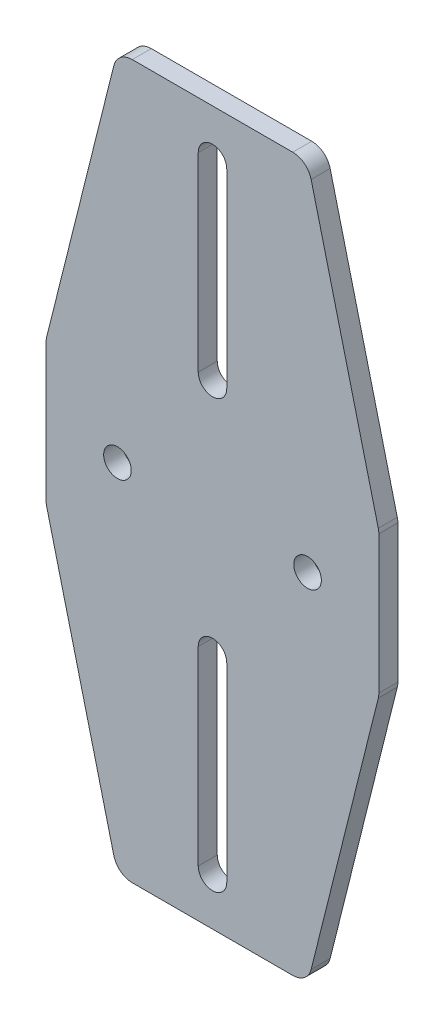
ISO-10303-21;
HEADER;
FILE_DESCRIPTION(('STEP AP214'),'2;1');
FILE_NAME('part.step','',(''),(''),'','','');
FILE_SCHEMA(('AUTOMOTIVE_DESIGN { 1 0 10303 214 1 1 1 1 }'));
ENDSEC;
DATA;
#1=APPLICATION_CONTEXT('core data for automotive mechanical design processes');
#2=APPLICATION_PROTOCOL_DEFINITION('international standard','automotive_design',2000,#1);
#3=PRODUCT_CONTEXT('',#1,'mechanical');
#4=PRODUCT('Part','Part','',(#3));
#5=PRODUCT_RELATED_PRODUCT_CATEGORY('part','',(#4));
#6=PRODUCT_DEFINITION_FORMATION('','',#4);
#7=PRODUCT_DEFINITION_CONTEXT('part definition',#1,'design');
#8=PRODUCT_DEFINITION('design','',#6,#7);
#9=PRODUCT_DEFINITION_SHAPE('','',#8);
#10=(LENGTH_UNIT() NAMED_UNIT(*) SI_UNIT(.MILLI.,.METRE.));
#11=(NAMED_UNIT(*) PLANE_ANGLE_UNIT() SI_UNIT($,.RADIAN.));
#12=(NAMED_UNIT(*) SI_UNIT($,.STERADIAN.) SOLID_ANGLE_UNIT());
#13=UNCERTAINTY_MEASURE_WITH_UNIT(LENGTH_MEASURE(1.E-05),#10,'distance_accuracy_value','');
#14=(GEOMETRIC_REPRESENTATION_CONTEXT(3) GLOBAL_UNCERTAINTY_ASSIGNED_CONTEXT((#13)) GLOBAL_UNIT_ASSIGNED_CONTEXT((#10,
#11,#12)) REPRESENTATION_CONTEXT('',''));
#15=CARTESIAN_POINT('',(0.,0.,0.));
#16=DIRECTION('',(0.,0.,1.));
#17=DIRECTION('',(1.,0.,0.));
#18=AXIS2_PLACEMENT_3D('',#15,#16,#17);
#19=CARTESIAN_POINT('',(0.,0.,2.));
#20=DIRECTION('',(1.,0.,0.));
#21=DIRECTION('',(0.,0.,-1.));
#22=AXIS2_PLACEMENT_3D('',#19,#20,#21);
#23=PLANE('',#22);
#24=DIRECTION('',(0.,-1.,0.));
#25=VECTOR('',#24,1.);
#26=CARTESIAN_POINT('',(0.,0.,0.));
#27=LINE('',#26,#25);
#28=CARTESIAN_POINT('',(0.,-0.246211251235321,0.));
#29=VERTEX_POINT('',#28);
#30=CARTESIAN_POINT('',(0.,-14.7537887487647,0.));
#31=VERTEX_POINT('',#30);
#32=EDGE_CURVE('E305',#29,#31,#27,.T.);
#33=ORIENTED_EDGE('',*,*,#32,.T.);
#34=DIRECTION('',(0.,0.,-1.));
#35=VECTOR('',#34,1.);
#36=CARTESIAN_POINT('',(0.,-14.7537887487647,2.));
#37=LINE('',#36,#35);
#38=CARTESIAN_POINT('',(0.,-14.7537887487647,2.));
#39=VERTEX_POINT('',#38);
#40=EDGE_CURVE('E380',#31,#39,#37,.F.);
#41=ORIENTED_EDGE('',*,*,#40,.T.);
#42=DIRECTION('',(0.,-1.,0.));
#43=VECTOR('',#42,1.);
#44=CARTESIAN_POINT('',(0.,0.,2.));
#45=LINE('',#44,#43);
#46=CARTESIAN_POINT('',(0.,-0.246211251235321,2.));
#47=VERTEX_POINT('',#46);
#48=EDGE_CURVE('E281',#47,#39,#45,.T.);
#49=ORIENTED_EDGE('',*,*,#48,.F.);
#50=DIRECTION('',(0.,0.,-1.));
#51=VECTOR('',#50,1.);
#52=CARTESIAN_POINT('',(0.,-0.246211251235321,2.));
#53=LINE('',#52,#51);
#54=EDGE_CURVE('E377',#47,#29,#53,.T.);
#55=ORIENTED_EDGE('',*,*,#54,.T.);
#56=EDGE_LOOP('',(#33,#41,#49,#55));
#57=FACE_BOUND('',#56,.T.);
#58=ADVANCED_FACE('F39',(#57),#23,.F.);
#59=CARTESIAN_POINT('',(0.,-15.,2.));
#60=DIRECTION('',(0.970142500145332,0.242535625036333,0.));
#61=DIRECTION('',(-0.242535625036333,0.970142500145332,0.));
#62=AXIS2_PLACEMENT_3D('',#59,#60,#61);
#63=PLANE('',#62);
#64=DIRECTION('',(0.242535625036333,-0.970142500145332,0.));
#65=VECTOR('',#64,1.);
#66=CARTESIAN_POINT('',(0.,-15.,0.));
#67=LINE('',#66,#65);
#68=CARTESIAN_POINT('',(0.0597149997093364,-15.2388599988373,0.));
#69=VERTEX_POINT('',#68);
#70=CARTESIAN_POINT('',(7.12126781251817,-43.4850712500727,0.));
#71=VERTEX_POINT('',#70);
#72=EDGE_CURVE('E308',#69,#71,#67,.T.);
#73=ORIENTED_EDGE('',*,*,#72,.T.);
#74=DIRECTION('',(0.,0.,-1.));
#75=VECTOR('',#74,1.);
#76=CARTESIAN_POINT('',(7.12126781251817,-43.4850712500727,2.));
#77=LINE('',#76,#75);
#78=CARTESIAN_POINT('',(7.12126781251817,-43.4850712500727,2.));
#79=VERTEX_POINT('',#78);
#80=EDGE_CURVE('E375',#71,#79,#77,.F.);
#81=ORIENTED_EDGE('',*,*,#80,.T.);
#82=DIRECTION('',(0.242535625036333,-0.970142500145332,0.));
#83=VECTOR('',#82,1.);
#84=CARTESIAN_POINT('',(0.,-15.,2.));
#85=LINE('',#84,#83);
#86=CARTESIAN_POINT('',(0.0597149997093364,-15.2388599988373,2.));
#87=VERTEX_POINT('',#86);
#88=EDGE_CURVE('E284',#87,#79,#85,.T.);
#89=ORIENTED_EDGE('',*,*,#88,.F.);
#90=DIRECTION('',(0.,0.,-1.));
#91=VECTOR('',#90,1.);
#92=CARTESIAN_POINT('',(0.0597149997093364,-15.2388599988373,2.));
#93=LINE('',#92,#91);
#94=EDGE_CURVE('E372',#87,#69,#93,.T.);
#95=ORIENTED_EDGE('',*,*,#94,.T.);
#96=EDGE_LOOP('',(#73,#81,#89,#95));
#97=FACE_BOUND('',#96,.T.);
#98=ADVANCED_FACE('F415',(#97),#63,.F.);
#99=CARTESIAN_POINT('',(7.5,-45.,2.));
#100=DIRECTION('',(0.,1.,0.));
#101=DIRECTION('',(0.,0.,1.));
#102=AXIS2_PLACEMENT_3D('',#99,#100,#101);
#103=PLANE('',#102);
#104=DIRECTION('',(1.,0.,0.));
#105=VECTOR('',#104,1.);
#106=CARTESIAN_POINT('',(7.5,-45.,0.));
#107=LINE('',#106,#105);
#108=CARTESIAN_POINT('',(9.06155281280883,-45.,0.));
#109=VERTEX_POINT('',#108);
#110=CARTESIAN_POINT('',(25.9384471871912,-45.,0.));
#111=VERTEX_POINT('',#110);
#112=EDGE_CURVE('E311',#109,#111,#107,.T.);
#113=ORIENTED_EDGE('',*,*,#112,.T.);
#114=DIRECTION('',(0.,0.,-1.));
#115=VECTOR('',#114,1.);
#116=CARTESIAN_POINT('',(25.9384471871912,-45.,2.));
#117=LINE('',#116,#115);
#118=CARTESIAN_POINT('',(25.9384471871912,-45.,2.));
#119=VERTEX_POINT('',#118);
#120=EDGE_CURVE('E370',#111,#119,#117,.F.);
#121=ORIENTED_EDGE('',*,*,#120,.T.);
#122=DIRECTION('',(1.,0.,0.));
#123=VECTOR('',#122,1.);
#124=CARTESIAN_POINT('',(7.5,-45.,2.));
#125=LINE('',#124,#123);
#126=CARTESIAN_POINT('',(9.06155281280883,-45.,2.));
#127=VERTEX_POINT('',#126);
#128=EDGE_CURVE('E288',#127,#119,#125,.T.);
#129=ORIENTED_EDGE('',*,*,#128,.F.);
#130=DIRECTION('',(0.,0.,-1.));
#131=VECTOR('',#130,1.);
#132=CARTESIAN_POINT('',(9.06155281280883,-45.,2.));
#133=LINE('',#132,#131);
#134=EDGE_CURVE('E367',#127,#109,#133,.T.);
#135=ORIENTED_EDGE('',*,*,#134,.T.);
#136=EDGE_LOOP('',(#113,#121,#129,#135));
#137=FACE_BOUND('',#136,.T.);
#138=ADVANCED_FACE('F424',(#137),#103,.F.);
#139=CARTESIAN_POINT('',(27.5,-45.,2.));
#140=DIRECTION('',(-0.970142500145332,0.242535625036333,0.));
#141=DIRECTION('',(-0.242535625036333,-0.970142500145332,0.));
#142=AXIS2_PLACEMENT_3D('',#139,#140,#141);
#143=PLANE('',#142);
#144=DIRECTION('',(0.242535625036333,0.970142500145332,0.));
#145=VECTOR('',#144,1.);
#146=CARTESIAN_POINT('',(27.5,-45.,0.));
#147=LINE('',#146,#145);
#148=CARTESIAN_POINT('',(27.8787321874818,-43.4850712500727,0.));
#149=VERTEX_POINT('',#148);
#150=CARTESIAN_POINT('',(34.9402850002907,-15.2388599988374,0.));
#151=VERTEX_POINT('',#150);
#152=EDGE_CURVE('E314',#149,#151,#147,.T.);
#153=ORIENTED_EDGE('',*,*,#152,.T.);
#154=DIRECTION('',(0.,0.,-1.));
#155=VECTOR('',#154,1.);
#156=CARTESIAN_POINT('',(34.9402850002907,-15.2388599988374,2.));
#157=LINE('',#156,#155);
#158=CARTESIAN_POINT('',(34.9402850002907,-15.2388599988374,2.));
#159=VERTEX_POINT('',#158);
#160=EDGE_CURVE('E350',#151,#159,#157,.F.);
#161=ORIENTED_EDGE('',*,*,#160,.T.);
#162=DIRECTION('',(0.242535625036333,0.970142500145332,0.));
#163=VECTOR('',#162,1.);
#164=CARTESIAN_POINT('',(27.5,-45.,2.));
#165=LINE('',#164,#163);
#166=CARTESIAN_POINT('',(27.8787321874818,-43.4850712500727,2.));
#167=VERTEX_POINT('',#166);
#168=EDGE_CURVE('E291',#167,#159,#165,.T.);
#169=ORIENTED_EDGE('',*,*,#168,.F.);
#170=DIRECTION('',(0.,0.,-1.));
#171=VECTOR('',#170,1.);
#172=CARTESIAN_POINT('',(27.8787321874818,-43.4850712500727,2.));
#173=LINE('',#172,#171);
#174=EDGE_CURVE('E347',#167,#149,#173,.T.);
#175=ORIENTED_EDGE('',*,*,#174,.T.);
#176=EDGE_LOOP('',(#153,#161,#169,#175));
#177=FACE_BOUND('',#176,.T.);
#178=ADVANCED_FACE('F433',(#177),#143,.F.);
#179=CARTESIAN_POINT('',(35.,0.,2.));
#180=DIRECTION('',(-1.,0.,0.));
#181=DIRECTION('',(0.,0.,1.));
#182=AXIS2_PLACEMENT_3D('',#179,#180,#181);
#183=PLANE('',#182);
#184=DIRECTION('',(0.,1.,0.));
#185=VECTOR('',#184,1.);
#186=CARTESIAN_POINT('',(35.,0.,2.));
#187=LINE('',#186,#185);
#188=CARTESIAN_POINT('',(35.,-14.7537887487647,2.));
#189=VERTEX_POINT('',#188);
#190=CARTESIAN_POINT('',(35.,-0.246211251235313,2.));
#191=VERTEX_POINT('',#190);
#192=EDGE_CURVE('E294',#189,#191,#187,.T.);
#193=ORIENTED_EDGE('',*,*,#192,.F.);
#194=DIRECTION('',(0.,0.,-1.));
#195=VECTOR('',#194,1.);
#196=CARTESIAN_POINT('',(35.,-14.7537887487647,2.));
#197=LINE('',#196,#195);
#198=CARTESIAN_POINT('',(35.,-14.7537887487647,0.));
#199=VERTEX_POINT('',#198);
#200=EDGE_CURVE('E328',#189,#199,#197,.T.);
#201=ORIENTED_EDGE('',*,*,#200,.T.);
#202=DIRECTION('',(0.,1.,0.));
#203=VECTOR('',#202,1.);
#204=CARTESIAN_POINT('',(35.,0.,0.));
#205=LINE('',#204,#203);
#206=CARTESIAN_POINT('',(35.,-0.246211251235313,0.));
#207=VERTEX_POINT('',#206);
#208=EDGE_CURVE('E317',#199,#207,#205,.T.);
#209=ORIENTED_EDGE('',*,*,#208,.T.);
#210=DIRECTION('',(0.,0.,-1.));
#211=VECTOR('',#210,1.);
#212=CARTESIAN_POINT('',(35.,-0.246211251235313,2.));
#213=LINE('',#212,#211);
#214=EDGE_CURVE('E304',#207,#191,#213,.F.);
#215=ORIENTED_EDGE('',*,*,#214,.T.);
#216=EDGE_LOOP('',(#193,#201,#209,#215));
#217=FACE_BOUND('',#216,.T.);
#218=ADVANCED_FACE('F441',(#217),#183,.F.);
#219=CARTESIAN_POINT('',(27.5,30.,2.));
#220=DIRECTION('',(-0.970142500145332,-0.242535625036333,0.));
#221=DIRECTION('',(0.242535625036333,-0.970142500145332,0.));
#222=AXIS2_PLACEMENT_3D('',#219,#220,#221);
#223=PLANE('',#222);
#224=DIRECTION('',(-0.242535625036333,0.970142500145332,0.));
#225=VECTOR('',#224,1.);
#226=CARTESIAN_POINT('',(27.5,30.,0.));
#227=LINE('',#226,#225);
#228=CARTESIAN_POINT('',(34.9402850002907,0.238859998837354,0.));
#229=VERTEX_POINT('',#228);
#230=CARTESIAN_POINT('',(27.8787321874818,28.4850712500727,0.));
#231=VERTEX_POINT('',#230);
#232=EDGE_CURVE('E320',#229,#231,#227,.T.);
#233=ORIENTED_EDGE('',*,*,#232,.T.);
#234=DIRECTION('',(0.,0.,-1.));
#235=VECTOR('',#234,1.);
#236=CARTESIAN_POINT('',(27.8787321874818,28.4850712500727,2.));
#237=LINE('',#236,#235);
#238=CARTESIAN_POINT('',(27.8787321874818,28.4850712500727,2.));
#239=VERTEX_POINT('',#238);
#240=EDGE_CURVE('E390',#231,#239,#237,.F.);
#241=ORIENTED_EDGE('',*,*,#240,.T.);
#242=DIRECTION('',(-0.242535625036333,0.970142500145332,0.));
#243=VECTOR('',#242,1.);
#244=CARTESIAN_POINT('',(27.5,30.,2.));
#245=LINE('',#244,#243);
#246=CARTESIAN_POINT('',(34.9402850002907,0.238859998837354,2.));
#247=VERTEX_POINT('',#246);
#248=EDGE_CURVE('E297',#247,#239,#245,.T.);
#249=ORIENTED_EDGE('',*,*,#248,.F.);
#250=DIRECTION('',(0.,0.,-1.));
#251=VECTOR('',#250,1.);
#252=CARTESIAN_POINT('',(34.9402850002907,0.238859998837354,2.));
#253=LINE('',#252,#251);
#254=EDGE_CURVE('E387',#247,#229,#253,.T.);
#255=ORIENTED_EDGE('',*,*,#254,.T.);
#256=EDGE_LOOP('',(#233,#241,#249,#255));
#257=FACE_BOUND('',#256,.T.);
#258=ADVANCED_FACE('F450',(#257),#223,.F.);
#259=CARTESIAN_POINT('',(7.5,30.,2.));
#260=DIRECTION('',(0.,-1.,0.));
#261=DIRECTION('',(0.,0.,-1.));
#262=AXIS2_PLACEMENT_3D('',#259,#260,#261);
#263=PLANE('',#262);
#264=DIRECTION('',(-1.,0.,0.));
#265=VECTOR('',#264,1.);
#266=CARTESIAN_POINT('',(7.5,30.,2.));
#267=LINE('',#266,#265);
#268=CARTESIAN_POINT('',(25.9384471871912,30.,2.));
#269=VERTEX_POINT('',#268);
#270=CARTESIAN_POINT('',(9.06155281280883,30.,2.));
#271=VERTEX_POINT('',#270);
#272=EDGE_CURVE('E300',#269,#271,#267,.T.);
#273=ORIENTED_EDGE('',*,*,#272,.F.);
#274=DIRECTION('',(0.,0.,-1.));
#275=VECTOR('',#274,1.);
#276=CARTESIAN_POINT('',(25.9384471871912,30.,2.));
#277=LINE('',#276,#275);
#278=CARTESIAN_POINT('',(25.9384471871912,30.,0.));
#279=VERTEX_POINT('',#278);
#280=EDGE_CURVE('E384',#269,#279,#277,.T.);
#281=ORIENTED_EDGE('',*,*,#280,.T.);
#282=DIRECTION('',(-1.,0.,0.));
#283=VECTOR('',#282,1.);
#284=CARTESIAN_POINT('',(7.5,30.,0.));
#285=LINE('',#284,#283);
#286=CARTESIAN_POINT('',(9.06155281280883,30.,0.));
#287=VERTEX_POINT('',#286);
#288=EDGE_CURVE('E323',#279,#287,#285,.T.);
#289=ORIENTED_EDGE('',*,*,#288,.T.);
#290=DIRECTION('',(0.,0.,-1.));
#291=VECTOR('',#290,1.);
#292=CARTESIAN_POINT('',(9.06155281280883,30.,2.));
#293=LINE('',#292,#291);
#294=EDGE_CURVE('E382',#287,#271,#293,.F.);
#295=ORIENTED_EDGE('',*,*,#294,.T.);
#296=EDGE_LOOP('',(#273,#281,#289,#295));
#297=FACE_BOUND('',#296,.T.);
#298=ADVANCED_FACE('F458',(#297),#263,.F.);
#299=CARTESIAN_POINT('',(0.,0.,2.));
#300=DIRECTION('',(0.970142500145332,-0.242535625036333,0.));
#301=DIRECTION('',(0.242535625036333,0.970142500145332,0.));
#302=AXIS2_PLACEMENT_3D('',#299,#300,#301);
#303=PLANE('',#302);
#304=DIRECTION('',(-0.242535625036333,-0.970142500145332,0.));
#305=VECTOR('',#304,1.);
#306=CARTESIAN_POINT('',(0.,0.,0.));
#307=LINE('',#306,#305);
#308=CARTESIAN_POINT('',(7.12126781251817,28.4850712500727,0.));
#309=VERTEX_POINT('',#308);
#310=CARTESIAN_POINT('',(0.0597149997093364,0.238859998837345,0.));
#311=VERTEX_POINT('',#310);
#312=EDGE_CURVE('E285',#309,#311,#307,.T.);
#313=ORIENTED_EDGE('',*,*,#312,.T.);
#314=DIRECTION('',(0.,0.,-1.));
#315=VECTOR('',#314,1.);
#316=CARTESIAN_POINT('',(0.0597149997093364,0.238859998837345,2.));
#317=LINE('',#316,#315);
#318=CARTESIAN_POINT('',(0.0597149997093364,0.238859998837345,2.));
#319=VERTEX_POINT('',#318);
#320=EDGE_CURVE('E11',#311,#319,#317,.F.);
#321=ORIENTED_EDGE('',*,*,#320,.T.);
#322=DIRECTION('',(-0.242535625036333,-0.970142500145332,0.));
#323=VECTOR('',#322,1.);
#324=CARTESIAN_POINT('',(0.,0.,2.));
#325=LINE('',#324,#323);
#326=CARTESIAN_POINT('',(7.12126781251817,28.4850712500727,2.));
#327=VERTEX_POINT('',#326);
#328=EDGE_CURVE('E302',#327,#319,#325,.T.);
#329=ORIENTED_EDGE('',*,*,#328,.F.);
#330=DIRECTION('',(0.,0.,-1.));
#331=VECTOR('',#330,1.);
#332=CARTESIAN_POINT('',(7.12126781251817,28.4850712500727,2.));
#333=LINE('',#332,#331);
#334=EDGE_CURVE('E47',#327,#309,#333,.T.);
#335=ORIENTED_EDGE('',*,*,#334,.T.);
#336=EDGE_LOOP('',(#313,#321,#329,#335));
#337=FACE_BOUND('',#336,.T.);
#338=ADVANCED_FACE('F394',(#337),#303,.F.);
#339=CARTESIAN_POINT('',(0.,0.,2.));
#340=DIRECTION('',(0.,0.,1.));
#341=DIRECTION('',(1.,0.,0.));
#342=AXIS2_PLACEMENT_3D('',#339,#340,#341);
#343=PLANE('',#342);
#344=CARTESIAN_POINT('',(7.5,-7.5,2.));
#345=DIRECTION('',(0.,0.,1.));
#346=DIRECTION('',(1.,0.,0.));
#347=AXIS2_PLACEMENT_3D('',#344,#345,#346);
#348=CIRCLE('',#347,1.45);
#349=CARTESIAN_POINT('',(8.95,-7.5,2.));
#350=VERTEX_POINT('',#349);
#351=EDGE_CURVE('E226',#350,#350,#348,.T.);
#352=ORIENTED_EDGE('',*,*,#351,.F.);
#353=EDGE_LOOP('',(#352));
#354=FACE_BOUND('',#353,.T.);
#355=CARTESIAN_POINT('',(17.5,25.,2.));
#356=DIRECTION('',(0.,0.,1.));
#357=DIRECTION('',(1.,0.,0.));
#358=AXIS2_PLACEMENT_3D('',#355,#356,#357);
#359=CIRCLE('',#358,1.50000000000002);
#360=CARTESIAN_POINT('',(19.,25.,2.));
#361=VERTEX_POINT('',#360);
#362=CARTESIAN_POINT('',(16.,25.,2.));
#363=VERTEX_POINT('',#362);
#364=EDGE_CURVE('E203',#361,#363,#359,.T.);
#365=ORIENTED_EDGE('',*,*,#364,.F.);
#366=DIRECTION('',(0.,1.,0.));
#367=VECTOR('',#366,1.);
#368=CARTESIAN_POINT('',(19.,25.,2.));
#369=LINE('',#368,#367);
#370=CARTESIAN_POINT('',(19.,5.,2.));
#371=VERTEX_POINT('',#370);
#372=EDGE_CURVE('E214',#371,#361,#369,.T.);
#373=ORIENTED_EDGE('',*,*,#372,.F.);
#374=CARTESIAN_POINT('',(17.5,5.,2.));
#375=DIRECTION('',(0.,0.,1.));
#376=DIRECTION('',(1.,0.,0.));
#377=AXIS2_PLACEMENT_3D('',#374,#375,#376);
#378=CIRCLE('',#377,1.50000000000001);
#379=CARTESIAN_POINT('',(16.,5.,2.));
#380=VERTEX_POINT('',#379);
#381=EDGE_CURVE('E219',#380,#371,#378,.T.);
#382=ORIENTED_EDGE('',*,*,#381,.F.);
#383=DIRECTION('',(0.,-1.,0.));
#384=VECTOR('',#383,1.);
#385=CARTESIAN_POINT('',(16.,25.,2.));
#386=LINE('',#385,#384);
#387=EDGE_CURVE('E225',#363,#380,#386,.T.);
#388=ORIENTED_EDGE('',*,*,#387,.F.);
#389=EDGE_LOOP('',(#365,#373,#382,#388));
#390=FACE_BOUND('',#389,.T.);
#391=CARTESIAN_POINT('',(27.5,-7.5,2.));
#392=DIRECTION('',(0.,0.,1.));
#393=DIRECTION('',(-1.,0.,0.));
#394=AXIS2_PLACEMENT_3D('',#391,#392,#393);
#395=CIRCLE('',#394,1.45);
#396=CARTESIAN_POINT('',(26.05,-7.5,2.));
#397=VERTEX_POINT('',#396);
#398=EDGE_CURVE('E211',#397,#397,#395,.T.);
#399=ORIENTED_EDGE('',*,*,#398,.F.);
#400=EDGE_LOOP('',(#399));
#401=FACE_BOUND('',#400,.T.);
#402=CARTESIAN_POINT('',(17.5,-40.,2.));
#403=DIRECTION('',(0.,0.,1.));
#404=DIRECTION('',(-1.,0.,0.));
#405=AXIS2_PLACEMENT_3D('',#402,#403,#404);
#406=CIRCLE('',#405,1.50000000000002);
#407=CARTESIAN_POINT('',(16.,-40.,2.));
#408=VERTEX_POINT('',#407);
#409=CARTESIAN_POINT('',(19.,-40.,2.));
#410=VERTEX_POINT('',#409);
#411=EDGE_CURVE('E249',#408,#410,#406,.T.);
#412=ORIENTED_EDGE('',*,*,#411,.F.);
#413=DIRECTION('',(0.,-1.,0.));
#414=VECTOR('',#413,1.);
#415=CARTESIAN_POINT('',(16.,-40.,2.));
#416=LINE('',#415,#414);
#417=CARTESIAN_POINT('',(16.,-20.,2.));
#418=VERTEX_POINT('',#417);
#419=EDGE_CURVE('E260',#418,#408,#416,.T.);
#420=ORIENTED_EDGE('',*,*,#419,.F.);
#421=CARTESIAN_POINT('',(17.5,-20.,2.));
#422=DIRECTION('',(0.,0.,1.));
#423=DIRECTION('',(-1.,0.,0.));
#424=AXIS2_PLACEMENT_3D('',#421,#422,#423);
#425=CIRCLE('',#424,1.50000000000001);
#426=CARTESIAN_POINT('',(19.,-20.,2.));
#427=VERTEX_POINT('',#426);
#428=EDGE_CURVE('E263',#427,#418,#425,.T.);
#429=ORIENTED_EDGE('',*,*,#428,.F.);
#430=DIRECTION('',(0.,1.,0.));
#431=VECTOR('',#430,1.);
#432=CARTESIAN_POINT('',(19.,-40.,2.));
#433=LINE('',#432,#431);
#434=EDGE_CURVE('E267',#410,#427,#433,.T.);
#435=ORIENTED_EDGE('',*,*,#434,.F.);
#436=EDGE_LOOP('',(#412,#420,#429,#435));
#437=FACE_BOUND('',#436,.T.);
#438=ORIENTED_EDGE('',*,*,#168,.T.);
#439=CARTESIAN_POINT('',(33.,-14.7537887487647,2.));
#440=DIRECTION('',(0.,0.,1.));
#441=DIRECTION('',(1.,0.,0.));
#442=AXIS2_PLACEMENT_3D('',#439,#440,#441);
#443=CIRCLE('',#442,2.);
#444=EDGE_CURVE('E365',#159,#189,#443,.T.);
#445=ORIENTED_EDGE('',*,*,#444,.T.);
#446=ORIENTED_EDGE('',*,*,#192,.T.);
#447=CARTESIAN_POINT('',(33.,-0.246211251235313,2.));
#448=DIRECTION('',(0.,0.,1.));
#449=DIRECTION('',(1.,0.,0.));
#450=AXIS2_PLACEMENT_3D('',#447,#448,#449);
#451=CIRCLE('',#450,2.);
#452=EDGE_CURVE('E355',#191,#247,#451,.T.);
#453=ORIENTED_EDGE('',*,*,#452,.T.);
#454=ORIENTED_EDGE('',*,*,#248,.T.);
#455=CARTESIAN_POINT('',(25.9384471871912,28.,2.));
#456=DIRECTION('',(0.,0.,1.));
#457=DIRECTION('',(1.,0.,0.));
#458=AXIS2_PLACEMENT_3D('',#455,#456,#457);
#459=CIRCLE('',#458,2.);
#460=EDGE_CURVE('E357',#239,#269,#459,.T.);
#461=ORIENTED_EDGE('',*,*,#460,.T.);
#462=ORIENTED_EDGE('',*,*,#272,.T.);
#463=CARTESIAN_POINT('',(9.06155281280883,28.,2.));
#464=DIRECTION('',(0.,0.,1.));
#465=DIRECTION('',(1.,0.,0.));
#466=AXIS2_PLACEMENT_3D('',#463,#464,#465);
#467=CIRCLE('',#466,2.);
#468=EDGE_CURVE('E59',#271,#327,#467,.T.);
#469=ORIENTED_EDGE('',*,*,#468,.T.);
#470=ORIENTED_EDGE('',*,*,#328,.T.);
#471=CARTESIAN_POINT('',(2.,-0.246211251235321,2.));
#472=DIRECTION('',(0.,0.,1.));
#473=DIRECTION('',(1.,0.,0.));
#474=AXIS2_PLACEMENT_3D('',#471,#472,#473);
#475=CIRCLE('',#474,2.);
#476=EDGE_CURVE('E353',#319,#47,#475,.T.);
#477=ORIENTED_EDGE('',*,*,#476,.T.);
#478=ORIENTED_EDGE('',*,*,#48,.T.);
#479=CARTESIAN_POINT('',(2.,-14.7537887487647,2.));
#480=DIRECTION('',(0.,0.,1.));
#481=DIRECTION('',(1.,0.,0.));
#482=AXIS2_PLACEMENT_3D('',#479,#480,#481);
#483=CIRCLE('',#482,2.);
#484=EDGE_CURVE('E359',#39,#87,#483,.T.);
#485=ORIENTED_EDGE('',*,*,#484,.T.);
#486=ORIENTED_EDGE('',*,*,#88,.T.);
#487=CARTESIAN_POINT('',(9.06155281280883,-43.,2.));
#488=DIRECTION('',(0.,0.,1.));
#489=DIRECTION('',(1.,0.,0.));
#490=AXIS2_PLACEMENT_3D('',#487,#488,#489);
#491=CIRCLE('',#490,2.);
#492=EDGE_CURVE('E361',#79,#127,#491,.T.);
#493=ORIENTED_EDGE('',*,*,#492,.T.);
#494=ORIENTED_EDGE('',*,*,#128,.T.);
#495=CARTESIAN_POINT('',(25.9384471871912,-43.,2.));
#496=DIRECTION('',(0.,0.,1.));
#497=DIRECTION('',(1.,0.,0.));
#498=AXIS2_PLACEMENT_3D('',#495,#496,#497);
#499=CIRCLE('',#498,2.);
#500=EDGE_CURVE('E363',#119,#167,#499,.T.);
#501=ORIENTED_EDGE('',*,*,#500,.T.);
#502=EDGE_LOOP('',(#438,#445,#446,#453,#454,#461,#462,#469,#470,#477,#478,#485,#486,#493,#494,#501));
#503=FACE_BOUND('',#502,.T.);
#504=ADVANCED_FACE('F222',(#354,#390,#401,#437,#503),#343,.T.);
#505=CARTESIAN_POINT('',(0.,0.,0.));
#506=DIRECTION('',(0.,0.,1.));
#507=DIRECTION('',(1.,0.,0.));
#508=AXIS2_PLACEMENT_3D('',#505,#506,#507);
#509=PLANE('',#508);
#510=CARTESIAN_POINT('',(7.5,-7.5,0.));
#511=DIRECTION('',(0.,0.,1.));
#512=DIRECTION('',(1.,0.,0.));
#513=AXIS2_PLACEMENT_3D('',#510,#511,#512);
#514=CIRCLE('',#513,1.45);
#515=CARTESIAN_POINT('',(8.95,-7.5,0.));
#516=VERTEX_POINT('',#515);
#517=EDGE_CURVE('E229',#516,#516,#514,.T.);
#518=ORIENTED_EDGE('',*,*,#517,.T.);
#519=EDGE_LOOP('',(#518));
#520=FACE_BOUND('',#519,.T.);
#521=DIRECTION('',(0.,1.,0.));
#522=VECTOR('',#521,1.);
#523=CARTESIAN_POINT('',(19.,25.,0.));
#524=LINE('',#523,#522);
#525=CARTESIAN_POINT('',(19.,5.,0.));
#526=VERTEX_POINT('',#525);
#527=CARTESIAN_POINT('',(19.,25.,0.));
#528=VERTEX_POINT('',#527);
#529=EDGE_CURVE('E234',#526,#528,#524,.T.);
#530=ORIENTED_EDGE('',*,*,#529,.T.);
#531=CARTESIAN_POINT('',(17.5,25.,0.));
#532=DIRECTION('',(0.,0.,1.));
#533=DIRECTION('',(1.,0.,0.));
#534=AXIS2_PLACEMENT_3D('',#531,#532,#533);
#535=CIRCLE('',#534,1.50000000000002);
#536=CARTESIAN_POINT('',(16.,25.,0.));
#537=VERTEX_POINT('',#536);
#538=EDGE_CURVE('E206',#528,#537,#535,.T.);
#539=ORIENTED_EDGE('',*,*,#538,.T.);
#540=DIRECTION('',(0.,-1.,0.));
#541=VECTOR('',#540,1.);
#542=CARTESIAN_POINT('',(16.,25.,0.));
#543=LINE('',#542,#541);
#544=CARTESIAN_POINT('',(16.,5.,0.));
#545=VERTEX_POINT('',#544);
#546=EDGE_CURVE('E240',#537,#545,#543,.T.);
#547=ORIENTED_EDGE('',*,*,#546,.T.);
#548=CARTESIAN_POINT('',(17.5,5.,0.));
#549=DIRECTION('',(0.,0.,1.));
#550=DIRECTION('',(1.,0.,0.));
#551=AXIS2_PLACEMENT_3D('',#548,#549,#550);
#552=CIRCLE('',#551,1.50000000000001);
#553=EDGE_CURVE('E236',#545,#526,#552,.T.);
#554=ORIENTED_EDGE('',*,*,#553,.T.);
#555=EDGE_LOOP('',(#530,#539,#547,#554));
#556=FACE_BOUND('',#555,.T.);
#557=CARTESIAN_POINT('',(27.5,-7.5,0.));
#558=DIRECTION('',(0.,0.,1.));
#559=DIRECTION('',(-1.,0.,0.));
#560=AXIS2_PLACEMENT_3D('',#557,#558,#559);
#561=CIRCLE('',#560,1.45);
#562=CARTESIAN_POINT('',(26.05,-7.5,0.));
#563=VERTEX_POINT('',#562);
#564=EDGE_CURVE('E246',#563,#563,#561,.T.);
#565=ORIENTED_EDGE('',*,*,#564,.T.);
#566=EDGE_LOOP('',(#565));
#567=FACE_BOUND('',#566,.T.);
#568=DIRECTION('',(0.,-1.,0.));
#569=VECTOR('',#568,1.);
#570=CARTESIAN_POINT('',(16.,-40.,0.));
#571=LINE('',#570,#569);
#572=CARTESIAN_POINT('',(16.,-20.,0.));
#573=VERTEX_POINT('',#572);
#574=CARTESIAN_POINT('',(16.,-40.,0.));
#575=VERTEX_POINT('',#574);
#576=EDGE_CURVE('E253',#573,#575,#571,.T.);
#577=ORIENTED_EDGE('',*,*,#576,.T.);
#578=CARTESIAN_POINT('',(17.5,-40.,0.));
#579=DIRECTION('',(0.,0.,1.));
#580=DIRECTION('',(-1.,0.,0.));
#581=AXIS2_PLACEMENT_3D('',#578,#579,#580);
#582=CIRCLE('',#581,1.50000000000002);
#583=CARTESIAN_POINT('',(19.,-40.,0.));
#584=VERTEX_POINT('',#583);
#585=EDGE_CURVE('E264',#575,#584,#582,.T.);
#586=ORIENTED_EDGE('',*,*,#585,.T.);
#587=DIRECTION('',(0.,1.,0.));
#588=VECTOR('',#587,1.);
#589=CARTESIAN_POINT('',(19.,-40.,0.));
#590=LINE('',#589,#588);
#591=CARTESIAN_POINT('',(19.,-20.,0.));
#592=VERTEX_POINT('',#591);
#593=EDGE_CURVE('E276',#584,#592,#590,.T.);
#594=ORIENTED_EDGE('',*,*,#593,.T.);
#595=CARTESIAN_POINT('',(17.5,-20.,0.));
#596=DIRECTION('',(0.,0.,1.));
#597=DIRECTION('',(-1.,0.,0.));
#598=AXIS2_PLACEMENT_3D('',#595,#596,#597);
#599=CIRCLE('',#598,1.50000000000001);
#600=EDGE_CURVE('E273',#592,#573,#599,.T.);
#601=ORIENTED_EDGE('',*,*,#600,.T.);
#602=EDGE_LOOP('',(#577,#586,#594,#601));
#603=FACE_BOUND('',#602,.T.);
#604=ORIENTED_EDGE('',*,*,#208,.F.);
#605=CARTESIAN_POINT('',(33.,-14.7537887487647,0.));
#606=DIRECTION('',(0.,0.,1.));
#607=DIRECTION('',(1.,0.,0.));
#608=AXIS2_PLACEMENT_3D('',#605,#606,#607);
#609=CIRCLE('',#608,2.);
#610=EDGE_CURVE('E345',#199,#151,#609,.F.);
#611=ORIENTED_EDGE('',*,*,#610,.T.);
#612=ORIENTED_EDGE('',*,*,#152,.F.);
#613=CARTESIAN_POINT('',(25.9384471871912,-43.,0.));
#614=DIRECTION('',(0.,0.,1.));
#615=DIRECTION('',(1.,0.,0.));
#616=AXIS2_PLACEMENT_3D('',#613,#614,#615);
#617=CIRCLE('',#616,2.);
#618=EDGE_CURVE('E343',#149,#111,#617,.F.);
#619=ORIENTED_EDGE('',*,*,#618,.T.);
#620=ORIENTED_EDGE('',*,*,#112,.F.);
#621=CARTESIAN_POINT('',(9.06155281280883,-43.,0.));
#622=DIRECTION('',(0.,0.,1.));
#623=DIRECTION('',(1.,0.,0.));
#624=AXIS2_PLACEMENT_3D('',#621,#622,#623);
#625=CIRCLE('',#624,2.);
#626=EDGE_CURVE('E341',#109,#71,#625,.F.);
#627=ORIENTED_EDGE('',*,*,#626,.T.);
#628=ORIENTED_EDGE('',*,*,#72,.F.);
#629=CARTESIAN_POINT('',(2.,-14.7537887487647,0.));
#630=DIRECTION('',(0.,0.,1.));
#631=DIRECTION('',(1.,0.,0.));
#632=AXIS2_PLACEMENT_3D('',#629,#630,#631);
#633=CIRCLE('',#632,2.);
#634=EDGE_CURVE('E339',#69,#31,#633,.F.);
#635=ORIENTED_EDGE('',*,*,#634,.T.);
#636=ORIENTED_EDGE('',*,*,#32,.F.);
#637=CARTESIAN_POINT('',(2.,-0.246211251235321,0.));
#638=DIRECTION('',(0.,0.,1.));
#639=DIRECTION('',(1.,0.,0.));
#640=AXIS2_PLACEMENT_3D('',#637,#638,#639);
#641=CIRCLE('',#640,2.);
#642=EDGE_CURVE('E333',#29,#311,#641,.F.);
#643=ORIENTED_EDGE('',*,*,#642,.T.);
#644=ORIENTED_EDGE('',*,*,#312,.F.);
#645=CARTESIAN_POINT('',(9.06155281280883,28.,0.));
#646=DIRECTION('',(0.,0.,1.));
#647=DIRECTION('',(1.,0.,0.));
#648=AXIS2_PLACEMENT_3D('',#645,#646,#647);
#649=CIRCLE('',#648,2.);
#650=EDGE_CURVE('E331',#309,#287,#649,.F.);
#651=ORIENTED_EDGE('',*,*,#650,.T.);
#652=ORIENTED_EDGE('',*,*,#288,.F.);
#653=CARTESIAN_POINT('',(25.9384471871912,28.,0.));
#654=DIRECTION('',(0.,0.,1.));
#655=DIRECTION('',(1.,0.,0.));
#656=AXIS2_PLACEMENT_3D('',#653,#654,#655);
#657=CIRCLE('',#656,2.);
#658=EDGE_CURVE('E337',#279,#231,#657,.F.);
#659=ORIENTED_EDGE('',*,*,#658,.T.);
#660=ORIENTED_EDGE('',*,*,#232,.F.);
#661=CARTESIAN_POINT('',(33.,-0.246211251235313,0.));
#662=DIRECTION('',(0.,0.,1.));
#663=DIRECTION('',(1.,0.,0.));
#664=AXIS2_PLACEMENT_3D('',#661,#662,#663);
#665=CIRCLE('',#664,2.);
#666=EDGE_CURVE('E335',#229,#207,#665,.F.);
#667=ORIENTED_EDGE('',*,*,#666,.T.);
#668=EDGE_LOOP('',(#604,#611,#612,#619,#620,#627,#628,#635,#636,#643,#644,#651,#652,#659,#660,#667));
#669=FACE_BOUND('',#668,.T.);
#670=ADVANCED_FACE('F398',(#520,#556,#567,#603,#669),#509,.F.);
#671=CARTESIAN_POINT('',(17.5,-40.,0.));
#672=DIRECTION('',(0.,0.,1.));
#673=DIRECTION('',(1.,0.,0.));
#674=AXIS2_PLACEMENT_3D('',#671,#672,#673);
#675=CYLINDRICAL_SURFACE('',#674,1.50000000000002);
#676=ORIENTED_EDGE('',*,*,#411,.T.);
#677=DIRECTION('',(0.,0.,1.));
#678=VECTOR('',#677,1.);
#679=CARTESIAN_POINT('',(19.,-40.,0.));
#680=LINE('',#679,#678);
#681=EDGE_CURVE('E250',#584,#410,#680,.T.);
#682=ORIENTED_EDGE('',*,*,#681,.F.);
#683=ORIENTED_EDGE('',*,*,#585,.F.);
#684=DIRECTION('',(0.,0.,1.));
#685=VECTOR('',#684,1.);
#686=CARTESIAN_POINT('',(16.,-40.,0.));
#687=LINE('',#686,#685);
#688=EDGE_CURVE('E258',#575,#408,#687,.T.);
#689=ORIENTED_EDGE('',*,*,#688,.T.);
#690=EDGE_LOOP('',(#676,#682,#683,#689));
#691=FACE_BOUND('',#690,.T.);
#692=ADVANCED_FACE('F599',(#691),#675,.F.);
#693=CARTESIAN_POINT('',(16.,-40.,0.));
#694=DIRECTION('',(-1.,0.,0.));
#695=DIRECTION('',(0.,-1.,0.));
#696=AXIS2_PLACEMENT_3D('',#693,#694,#695);
#697=PLANE('',#696);
#698=ORIENTED_EDGE('',*,*,#419,.T.);
#699=ORIENTED_EDGE('',*,*,#688,.F.);
#700=ORIENTED_EDGE('',*,*,#576,.F.);
#701=DIRECTION('',(0.,0.,1.));
#702=VECTOR('',#701,1.);
#703=CARTESIAN_POINT('',(16.,-20.,0.));
#704=LINE('',#703,#702);
#705=EDGE_CURVE('E256',#573,#418,#704,.T.);
#706=ORIENTED_EDGE('',*,*,#705,.T.);
#707=EDGE_LOOP('',(#698,#699,#700,#706));
#708=FACE_BOUND('',#707,.T.);
#709=ADVANCED_FACE('F590',(#708),#697,.F.);
#710=CARTESIAN_POINT('',(17.5,-20.,0.));
#711=DIRECTION('',(0.,0.,1.));
#712=DIRECTION('',(1.,0.,0.));
#713=AXIS2_PLACEMENT_3D('',#710,#711,#712);
#714=CYLINDRICAL_SURFACE('',#713,1.50000000000001);
#715=ORIENTED_EDGE('',*,*,#428,.T.);
#716=ORIENTED_EDGE('',*,*,#705,.F.);
#717=ORIENTED_EDGE('',*,*,#600,.F.);
#718=DIRECTION('',(0.,0.,1.));
#719=VECTOR('',#718,1.);
#720=CARTESIAN_POINT('',(19.,-20.,0.));
#721=LINE('',#720,#719);
#722=EDGE_CURVE('E254',#592,#427,#721,.T.);
#723=ORIENTED_EDGE('',*,*,#722,.T.);
#724=EDGE_LOOP('',(#715,#716,#717,#723));
#725=FACE_BOUND('',#724,.T.);
#726=ADVANCED_FACE('F581',(#725),#714,.F.);
#727=CARTESIAN_POINT('',(19.,-40.,0.));
#728=DIRECTION('',(1.,0.,0.));
#729=DIRECTION('',(0.,1.,0.));
#730=AXIS2_PLACEMENT_3D('',#727,#728,#729);
#731=PLANE('',#730);
#732=ORIENTED_EDGE('',*,*,#434,.T.);
#733=ORIENTED_EDGE('',*,*,#722,.F.);
#734=ORIENTED_EDGE('',*,*,#593,.F.);
#735=ORIENTED_EDGE('',*,*,#681,.T.);
#736=EDGE_LOOP('',(#732,#733,#734,#735));
#737=FACE_BOUND('',#736,.T.);
#738=ADVANCED_FACE('F572',(#737),#731,.F.);
#739=CARTESIAN_POINT('',(27.5,-7.5,0.));
#740=DIRECTION('',(0.,0.,1.));
#741=DIRECTION('',(1.,0.,0.));
#742=AXIS2_PLACEMENT_3D('',#739,#740,#741);
#743=CYLINDRICAL_SURFACE('',#742,1.45);
#744=ORIENTED_EDGE('',*,*,#564,.F.);
#745=EDGE_LOOP('',(#744));
#746=FACE_BOUND('',#745,.T.);
#747=ORIENTED_EDGE('',*,*,#398,.T.);
#748=EDGE_LOOP('',(#747));
#749=FACE_BOUND('',#748,.T.);
#750=ADVANCED_FACE('F564',(#746,#749),#743,.F.);
#751=CARTESIAN_POINT('',(17.5,25.,0.));
#752=DIRECTION('',(0.,0.,1.));
#753=DIRECTION('',(1.,0.,0.));
#754=AXIS2_PLACEMENT_3D('',#751,#752,#753);
#755=CYLINDRICAL_SURFACE('',#754,1.50000000000002);
#756=ORIENTED_EDGE('',*,*,#364,.T.);
#757=DIRECTION('',(0.,0.,1.));
#758=VECTOR('',#757,1.);
#759=CARTESIAN_POINT('',(16.,25.,0.));
#760=LINE('',#759,#758);
#761=EDGE_CURVE('E237',#537,#363,#760,.T.);
#762=ORIENTED_EDGE('',*,*,#761,.F.);
#763=ORIENTED_EDGE('',*,*,#538,.F.);
#764=DIRECTION('',(0.,0.,1.));
#765=VECTOR('',#764,1.);
#766=CARTESIAN_POINT('',(19.,25.,0.));
#767=LINE('',#766,#765);
#768=EDGE_CURVE('E199',#528,#361,#767,.T.);
#769=ORIENTED_EDGE('',*,*,#768,.T.);
#770=EDGE_LOOP('',(#756,#762,#763,#769));
#771=FACE_BOUND('',#770,.T.);
#772=ADVANCED_FACE('F201',(#771),#755,.F.);
#773=CARTESIAN_POINT('',(19.,25.,0.));
#774=DIRECTION('',(1.,0.,0.));
#775=DIRECTION('',(0.,1.,0.));
#776=AXIS2_PLACEMENT_3D('',#773,#774,#775);
#777=PLANE('',#776);
#778=ORIENTED_EDGE('',*,*,#372,.T.);
#779=ORIENTED_EDGE('',*,*,#768,.F.);
#780=ORIENTED_EDGE('',*,*,#529,.F.);
#781=DIRECTION('',(0.,0.,1.));
#782=VECTOR('',#781,1.);
#783=CARTESIAN_POINT('',(19.,5.,0.));
#784=LINE('',#783,#782);
#785=EDGE_CURVE('E210',#526,#371,#784,.T.);
#786=ORIENTED_EDGE('',*,*,#785,.T.);
#787=EDGE_LOOP('',(#778,#779,#780,#786));
#788=FACE_BOUND('',#787,.T.);
#789=ADVANCED_FACE('F215',(#788),#777,.F.);
#790=CARTESIAN_POINT('',(17.5,5.,0.));
#791=DIRECTION('',(0.,0.,1.));
#792=DIRECTION('',(1.,0.,0.));
#793=AXIS2_PLACEMENT_3D('',#790,#791,#792);
#794=CYLINDRICAL_SURFACE('',#793,1.50000000000001);
#795=ORIENTED_EDGE('',*,*,#381,.T.);
#796=ORIENTED_EDGE('',*,*,#785,.F.);
#797=ORIENTED_EDGE('',*,*,#553,.F.);
#798=DIRECTION('',(0.,0.,1.));
#799=VECTOR('',#798,1.);
#800=CARTESIAN_POINT('',(16.,5.,0.));
#801=LINE('',#800,#799);
#802=EDGE_CURVE('E711',#545,#380,#801,.T.);
#803=ORIENTED_EDGE('',*,*,#802,.T.);
#804=EDGE_LOOP('',(#795,#796,#797,#803));
#805=FACE_BOUND('',#804,.T.);
#806=ADVANCED_FACE('F540',(#805),#794,.F.);
#807=CARTESIAN_POINT('',(16.,25.,0.));
#808=DIRECTION('',(-1.,0.,0.));
#809=DIRECTION('',(0.,-1.,0.));
#810=AXIS2_PLACEMENT_3D('',#807,#808,#809);
#811=PLANE('',#810);
#812=ORIENTED_EDGE('',*,*,#387,.T.);
#813=ORIENTED_EDGE('',*,*,#802,.F.);
#814=ORIENTED_EDGE('',*,*,#546,.F.);
#815=ORIENTED_EDGE('',*,*,#761,.T.);
#816=EDGE_LOOP('',(#812,#813,#814,#815));
#817=FACE_BOUND('',#816,.T.);
#818=ADVANCED_FACE('F531',(#817),#811,.F.);
#819=CARTESIAN_POINT('',(7.5,-7.5,0.));
#820=DIRECTION('',(0.,0.,1.));
#821=DIRECTION('',(1.,0.,0.));
#822=AXIS2_PLACEMENT_3D('',#819,#820,#821);
#823=CYLINDRICAL_SURFACE('',#822,1.45);
#824=ORIENTED_EDGE('',*,*,#517,.F.);
#825=EDGE_LOOP('',(#824));
#826=FACE_BOUND('',#825,.T.);
#827=ORIENTED_EDGE('',*,*,#351,.T.);
#828=EDGE_LOOP('',(#827));
#829=FACE_BOUND('',#828,.T.);
#830=ADVANCED_FACE('F475',(#826,#829),#823,.F.);
#831=CARTESIAN_POINT('',(33.,-14.7537887487647,2.));
#832=DIRECTION('',(0.,0.,-1.));
#833=DIRECTION('',(-1.,0.,0.));
#834=AXIS2_PLACEMENT_3D('',#831,#832,#833);
#835=CYLINDRICAL_SURFACE('',#834,2.);
#836=ORIENTED_EDGE('',*,*,#444,.F.);
#837=ORIENTED_EDGE('',*,*,#160,.F.);
#838=ORIENTED_EDGE('',*,*,#610,.F.);
#839=ORIENTED_EDGE('',*,*,#200,.F.);
#840=EDGE_LOOP('',(#836,#837,#838,#839));
#841=FACE_BOUND('',#840,.T.);
#842=ADVANCED_FACE('F438',(#841),#835,.T.);
#843=CARTESIAN_POINT('',(25.9384471871912,-43.,2.));
#844=DIRECTION('',(0.,0.,-1.));
#845=DIRECTION('',(-1.,0.,0.));
#846=AXIS2_PLACEMENT_3D('',#843,#844,#845);
#847=CYLINDRICAL_SURFACE('',#846,2.);
#848=ORIENTED_EDGE('',*,*,#500,.F.);
#849=ORIENTED_EDGE('',*,*,#120,.F.);
#850=ORIENTED_EDGE('',*,*,#618,.F.);
#851=ORIENTED_EDGE('',*,*,#174,.F.);
#852=EDGE_LOOP('',(#848,#849,#850,#851));
#853=FACE_BOUND('',#852,.T.);
#854=ADVANCED_FACE('F430',(#853),#847,.T.);
#855=CARTESIAN_POINT('',(9.06155281280883,-43.,2.));
#856=DIRECTION('',(0.,0.,-1.));
#857=DIRECTION('',(-1.,0.,0.));
#858=AXIS2_PLACEMENT_3D('',#855,#856,#857);
#859=CYLINDRICAL_SURFACE('',#858,2.);
#860=ORIENTED_EDGE('',*,*,#492,.F.);
#861=ORIENTED_EDGE('',*,*,#80,.F.);
#862=ORIENTED_EDGE('',*,*,#626,.F.);
#863=ORIENTED_EDGE('',*,*,#134,.F.);
#864=EDGE_LOOP('',(#860,#861,#862,#863));
#865=FACE_BOUND('',#864,.T.);
#866=ADVANCED_FACE('F421',(#865),#859,.T.);
#867=CARTESIAN_POINT('',(2.,-14.7537887487647,2.));
#868=DIRECTION('',(0.,0.,-1.));
#869=DIRECTION('',(-1.,0.,0.));
#870=AXIS2_PLACEMENT_3D('',#867,#868,#869);
#871=CYLINDRICAL_SURFACE('',#870,2.);
#872=ORIENTED_EDGE('',*,*,#484,.F.);
#873=ORIENTED_EDGE('',*,*,#40,.F.);
#874=ORIENTED_EDGE('',*,*,#634,.F.);
#875=ORIENTED_EDGE('',*,*,#94,.F.);
#876=EDGE_LOOP('',(#872,#873,#874,#875));
#877=FACE_BOUND('',#876,.T.);
#878=ADVANCED_FACE('F412',(#877),#871,.T.);
#879=CARTESIAN_POINT('',(25.9384471871912,28.,2.));
#880=DIRECTION('',(0.,0.,-1.));
#881=DIRECTION('',(-1.,0.,0.));
#882=AXIS2_PLACEMENT_3D('',#879,#880,#881);
#883=CYLINDRICAL_SURFACE('',#882,2.);
#884=ORIENTED_EDGE('',*,*,#460,.F.);
#885=ORIENTED_EDGE('',*,*,#240,.F.);
#886=ORIENTED_EDGE('',*,*,#658,.F.);
#887=ORIENTED_EDGE('',*,*,#280,.F.);
#888=EDGE_LOOP('',(#884,#885,#886,#887));
#889=FACE_BOUND('',#888,.T.);
#890=ADVANCED_FACE('F455',(#889),#883,.T.);
#891=CARTESIAN_POINT('',(33.,-0.246211251235313,2.));
#892=DIRECTION('',(0.,0.,-1.));
#893=DIRECTION('',(-1.,0.,0.));
#894=AXIS2_PLACEMENT_3D('',#891,#892,#893);
#895=CYLINDRICAL_SURFACE('',#894,2.);
#896=ORIENTED_EDGE('',*,*,#452,.F.);
#897=ORIENTED_EDGE('',*,*,#214,.F.);
#898=ORIENTED_EDGE('',*,*,#666,.F.);
#899=ORIENTED_EDGE('',*,*,#254,.F.);
#900=EDGE_LOOP('',(#896,#897,#898,#899));
#901=FACE_BOUND('',#900,.T.);
#902=ADVANCED_FACE('F447',(#901),#895,.T.);
#903=CARTESIAN_POINT('',(2.,-0.246211251235321,2.));
#904=DIRECTION('',(0.,0.,-1.));
#905=DIRECTION('',(-1.,0.,0.));
#906=AXIS2_PLACEMENT_3D('',#903,#904,#905);
#907=CYLINDRICAL_SURFACE('',#906,2.);
#908=ORIENTED_EDGE('',*,*,#476,.F.);
#909=ORIENTED_EDGE('',*,*,#320,.F.);
#910=ORIENTED_EDGE('',*,*,#642,.F.);
#911=ORIENTED_EDGE('',*,*,#54,.F.);
#912=EDGE_LOOP('',(#908,#909,#910,#911));
#913=FACE_BOUND('',#912,.T.);
#914=ADVANCED_FACE('F404',(#913),#907,.T.);
#915=CARTESIAN_POINT('',(9.06155281280883,28.,2.));
#916=DIRECTION('',(0.,0.,-1.));
#917=DIRECTION('',(-1.,0.,0.));
#918=AXIS2_PLACEMENT_3D('',#915,#916,#917);
#919=CYLINDRICAL_SURFACE('',#918,2.);
#920=ORIENTED_EDGE('',*,*,#468,.F.);
#921=ORIENTED_EDGE('',*,*,#294,.F.);
#922=ORIENTED_EDGE('',*,*,#650,.F.);
#923=ORIENTED_EDGE('',*,*,#334,.F.);
#924=EDGE_LOOP('',(#920,#921,#922,#923));
#925=FACE_BOUND('',#924,.T.);
#926=ADVANCED_FACE('F41',(#925),#919,.T.);
#927=CLOSED_SHELL('',(#58,#98,#138,#178,#218,#258,#298,#338,#504,#670,#692,#709,#726,#738,#750,
#772,#789,#806,#818,#830,#842,#854,#866,#878,#890,#902,#914,#926));
#928=MANIFOLD_SOLID_BREP('B2',#927);
#929=ADVANCED_BREP_SHAPE_REPRESENTATION('',(#18,#928),#14);
#930=SHAPE_DEFINITION_REPRESENTATION(#9,#929);
ENDSEC;
END-ISO-10303-21;
